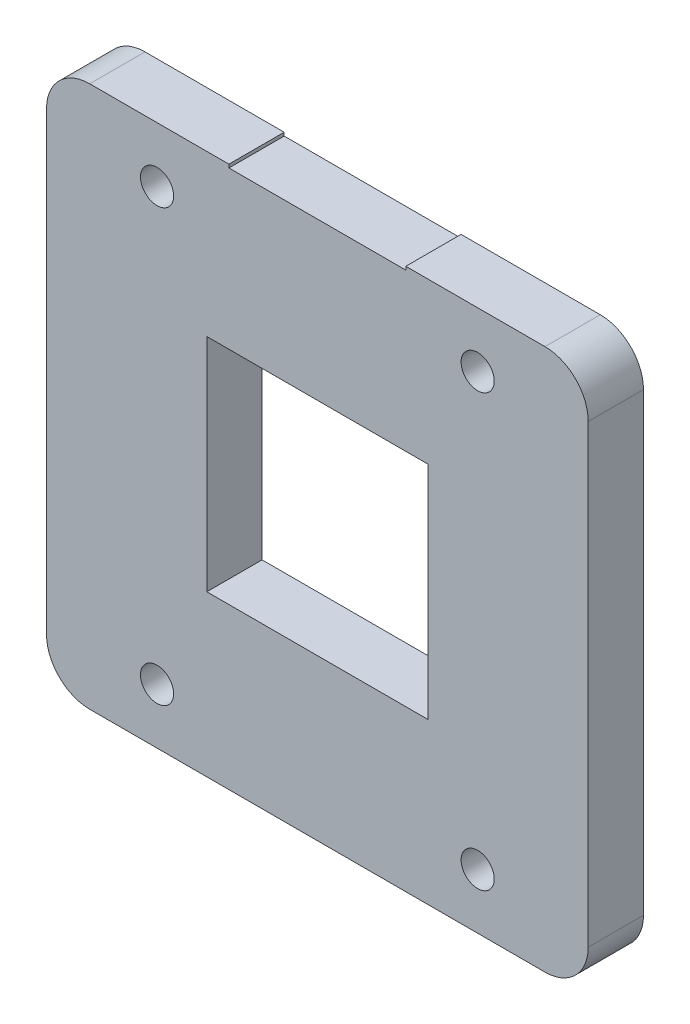
ISO-10303-21;
HEADER;
FILE_DESCRIPTION(('STEP AP214'),'2;1');
FILE_NAME('part.step','',(''),(''),'','','');
FILE_SCHEMA(('AUTOMOTIVE_DESIGN { 1 0 10303 214 1 1 1 1 }'));
ENDSEC;
DATA;
#1=APPLICATION_CONTEXT('core data for automotive mechanical design processes');
#2=APPLICATION_PROTOCOL_DEFINITION('international standard','automotive_design',2000,#1);
#3=PRODUCT_CONTEXT('',#1,'mechanical');
#4=PRODUCT('Part','Part','',(#3));
#5=PRODUCT_RELATED_PRODUCT_CATEGORY('part','',(#4));
#6=PRODUCT_DEFINITION_FORMATION('','',#4);
#7=PRODUCT_DEFINITION_CONTEXT('part definition',#1,'design');
#8=PRODUCT_DEFINITION('design','',#6,#7);
#9=PRODUCT_DEFINITION_SHAPE('','',#8);
#10=(LENGTH_UNIT() NAMED_UNIT(*) SI_UNIT(.MILLI.,.METRE.));
#11=(NAMED_UNIT(*) PLANE_ANGLE_UNIT() SI_UNIT($,.RADIAN.));
#12=(NAMED_UNIT(*) SI_UNIT($,.STERADIAN.) SOLID_ANGLE_UNIT());
#13=UNCERTAINTY_MEASURE_WITH_UNIT(LENGTH_MEASURE(1.E-05),#10,'distance_accuracy_value','');
#14=(GEOMETRIC_REPRESENTATION_CONTEXT(3) GLOBAL_UNCERTAINTY_ASSIGNED_CONTEXT((#13)) GLOBAL_UNIT_ASSIGNED_CONTEXT((#10,
#11,#12)) REPRESENTATION_CONTEXT('',''));
#15=CARTESIAN_POINT('',(0.,0.,0.));
#16=DIRECTION('',(0.,0.,1.));
#17=DIRECTION('',(1.,0.,0.));
#18=AXIS2_PLACEMENT_3D('',#15,#16,#17);
#19=CARTESIAN_POINT('',(0.,24.5,5.));
#20=DIRECTION('',(0.,1.,0.));
#21=DIRECTION('',(0.,0.,1.));
#22=AXIS2_PLACEMENT_3D('',#19,#20,#21);
#23=PLANE('',#22);
#24=DIRECTION('',(0.,0.,-1.));
#25=VECTOR('',#24,1.);
#26=CARTESIAN_POINT('',(8.,24.5,5.));
#27=LINE('',#26,#25);
#28=CARTESIAN_POINT('',(8.,24.5,5.));
#29=VERTEX_POINT('',#28);
#30=CARTESIAN_POINT('',(8.,24.5,0.));
#31=VERTEX_POINT('',#30);
#32=EDGE_CURVE('E183',#29,#31,#27,.T.);
#33=ORIENTED_EDGE('',*,*,#32,.F.);
#34=DIRECTION('',(1.,0.,0.));
#35=VECTOR('',#34,1.);
#36=CARTESIAN_POINT('',(0.,24.5,5.));
#37=LINE('',#36,#35);
#38=CARTESIAN_POINT('',(20.59,24.5,5.));
#39=VERTEX_POINT('',#38);
#40=EDGE_CURVE('E172',#29,#39,#37,.T.);
#41=ORIENTED_EDGE('',*,*,#40,.T.);
#42=DIRECTION('',(0.,0.,-1.));
#43=VECTOR('',#42,1.);
#44=CARTESIAN_POINT('',(20.59,24.5,5.));
#45=LINE('',#44,#43);
#46=CARTESIAN_POINT('',(20.59,24.5,0.));
#47=VERTEX_POINT('',#46);
#48=EDGE_CURVE('E293',#39,#47,#45,.T.);
#49=ORIENTED_EDGE('',*,*,#48,.T.);
#50=DIRECTION('',(1.,0.,0.));
#51=VECTOR('',#50,1.);
#52=CARTESIAN_POINT('',(0.,24.5,0.));
#53=LINE('',#52,#51);
#54=EDGE_CURVE('E269',#31,#47,#53,.T.);
#55=ORIENTED_EDGE('',*,*,#54,.F.);
#56=EDGE_LOOP('',(#33,#41,#49,#55));
#57=FACE_BOUND('',#56,.T.);
#58=ADVANCED_FACE('F41',(#57),#23,.T.);
#59=CARTESIAN_POINT('',(20.59,-20.59,5.));
#60=DIRECTION('',(0.,0.,-1.));
#61=DIRECTION('',(-1.,0.,0.));
#62=AXIS2_PLACEMENT_3D('',#59,#60,#61);
#63=CYLINDRICAL_SURFACE('',#62,3.91);
#64=CARTESIAN_POINT('',(20.59,-20.59,0.));
#65=DIRECTION('',(0.,0.,1.));
#66=DIRECTION('',(1.,0.,0.));
#67=AXIS2_PLACEMENT_3D('',#64,#65,#66);
#68=CIRCLE('',#67,3.91);
#69=CARTESIAN_POINT('',(24.5,-20.59,0.));
#70=VERTEX_POINT('',#69);
#71=CARTESIAN_POINT('',(20.59,-24.5,0.));
#72=VERTEX_POINT('',#71);
#73=EDGE_CURVE('E233',#70,#72,#68,.F.);
#74=ORIENTED_EDGE('',*,*,#73,.F.);
#75=DIRECTION('',(0.,0.,-1.));
#76=VECTOR('',#75,1.);
#77=CARTESIAN_POINT('',(24.5,-20.59,5.));
#78=LINE('',#77,#76);
#79=CARTESIAN_POINT('',(24.5,-20.59,5.));
#80=VERTEX_POINT('',#79);
#81=EDGE_CURVE('E49',#80,#70,#78,.T.);
#82=ORIENTED_EDGE('',*,*,#81,.F.);
#83=CARTESIAN_POINT('',(20.59,-20.59,5.));
#84=DIRECTION('',(0.,0.,1.));
#85=DIRECTION('',(1.,0.,0.));
#86=AXIS2_PLACEMENT_3D('',#83,#84,#85);
#87=CIRCLE('',#86,3.91);
#88=CARTESIAN_POINT('',(20.59,-24.5,5.));
#89=VERTEX_POINT('',#88);
#90=EDGE_CURVE('E239',#80,#89,#87,.F.);
#91=ORIENTED_EDGE('',*,*,#90,.T.);
#92=DIRECTION('',(0.,0.,-1.));
#93=VECTOR('',#92,1.);
#94=CARTESIAN_POINT('',(20.59,-24.5,5.));
#95=LINE('',#94,#93);
#96=EDGE_CURVE('E260',#89,#72,#95,.T.);
#97=ORIENTED_EDGE('',*,*,#96,.T.);
#98=EDGE_LOOP('',(#74,#82,#91,#97));
#99=FACE_BOUND('',#98,.T.);
#100=ADVANCED_FACE('F43',(#99),#63,.T.);
#101=CARTESIAN_POINT('',(24.5,0.,5.));
#102=DIRECTION('',(1.,0.,0.));
#103=DIRECTION('',(0.,1.,0.));
#104=AXIS2_PLACEMENT_3D('',#101,#102,#103);
#105=PLANE('',#104);
#106=DIRECTION('',(0.,-1.,0.));
#107=VECTOR('',#106,1.);
#108=CARTESIAN_POINT('',(24.5,0.,0.));
#109=LINE('',#108,#107);
#110=CARTESIAN_POINT('',(24.5,20.59,0.));
#111=VERTEX_POINT('',#110);
#112=EDGE_CURVE('E263',#111,#70,#109,.T.);
#113=ORIENTED_EDGE('',*,*,#112,.F.);
#114=DIRECTION('',(0.,0.,-1.));
#115=VECTOR('',#114,1.);
#116=CARTESIAN_POINT('',(24.5,20.59,5.));
#117=LINE('',#116,#115);
#118=CARTESIAN_POINT('',(24.5,20.59,5.));
#119=VERTEX_POINT('',#118);
#120=EDGE_CURVE('E296',#119,#111,#117,.T.);
#121=ORIENTED_EDGE('',*,*,#120,.F.);
#122=DIRECTION('',(0.,-1.,0.));
#123=VECTOR('',#122,1.);
#124=CARTESIAN_POINT('',(24.5,0.,5.));
#125=LINE('',#124,#123);
#126=EDGE_CURVE('E242',#119,#80,#125,.T.);
#127=ORIENTED_EDGE('',*,*,#126,.T.);
#128=ORIENTED_EDGE('',*,*,#81,.T.);
#129=EDGE_LOOP('',(#113,#121,#127,#128));
#130=FACE_BOUND('',#129,.T.);
#131=ADVANCED_FACE('F300',(#130),#105,.T.);
#132=CARTESIAN_POINT('',(20.59,20.59,5.));
#133=DIRECTION('',(0.,0.,-1.));
#134=DIRECTION('',(-1.,0.,0.));
#135=AXIS2_PLACEMENT_3D('',#132,#133,#134);
#136=CYLINDRICAL_SURFACE('',#135,3.91);
#137=CARTESIAN_POINT('',(20.59,20.59,0.));
#138=DIRECTION('',(0.,0.,1.));
#139=DIRECTION('',(1.,0.,0.));
#140=AXIS2_PLACEMENT_3D('',#137,#138,#139);
#141=CIRCLE('',#140,3.91);
#142=EDGE_CURVE('E266',#47,#111,#141,.F.);
#143=ORIENTED_EDGE('',*,*,#142,.F.);
#144=ORIENTED_EDGE('',*,*,#48,.F.);
#145=CARTESIAN_POINT('',(20.59,20.59,5.));
#146=DIRECTION('',(0.,0.,1.));
#147=DIRECTION('',(1.,0.,0.));
#148=AXIS2_PLACEMENT_3D('',#145,#146,#147);
#149=CIRCLE('',#148,3.91);
#150=EDGE_CURVE('E246',#39,#119,#149,.F.);
#151=ORIENTED_EDGE('',*,*,#150,.T.);
#152=ORIENTED_EDGE('',*,*,#120,.T.);
#153=EDGE_LOOP('',(#143,#144,#151,#152));
#154=FACE_BOUND('',#153,.T.);
#155=ADVANCED_FACE('F312',(#154),#136,.T.);
#156=DIRECTION('',(0.,0.,1.));
#157=VECTOR('',#156,1.);
#158=CARTESIAN_POINT('',(-8.,24.5,5.));
#159=LINE('',#158,#157);
#160=CARTESIAN_POINT('',(-8.,24.5,0.));
#161=VERTEX_POINT('',#160);
#162=CARTESIAN_POINT('',(-8.,24.5,5.));
#163=VERTEX_POINT('',#162);
#164=EDGE_CURVE('E180',#161,#163,#159,.T.);
#165=ORIENTED_EDGE('',*,*,#164,.F.);
#166=CARTESIAN_POINT('',(-20.59,24.5,0.));
#167=VERTEX_POINT('',#166);
#168=EDGE_CURVE('E270',#167,#161,#53,.T.);
#169=ORIENTED_EDGE('',*,*,#168,.F.);
#170=DIRECTION('',(0.,0.,-1.));
#171=VECTOR('',#170,1.);
#172=CARTESIAN_POINT('',(-20.59,24.5,5.));
#173=LINE('',#172,#171);
#174=CARTESIAN_POINT('',(-20.59,24.5,5.));
#175=VERTEX_POINT('',#174);
#176=EDGE_CURVE('E291',#175,#167,#173,.T.);
#177=ORIENTED_EDGE('',*,*,#176,.F.);
#178=EDGE_CURVE('E249',#175,#163,#37,.T.);
#179=ORIENTED_EDGE('',*,*,#178,.T.);
#180=EDGE_LOOP('',(#165,#169,#177,#179));
#181=FACE_BOUND('',#180,.T.);
#182=ADVANCED_FACE('F336',(#181),#23,.T.);
#183=CARTESIAN_POINT('',(-20.59,20.59,5.));
#184=DIRECTION('',(0.,0.,-1.));
#185=DIRECTION('',(-1.,0.,0.));
#186=AXIS2_PLACEMENT_3D('',#183,#184,#185);
#187=CYLINDRICAL_SURFACE('',#186,3.91);
#188=CARTESIAN_POINT('',(-20.59,20.59,0.));
#189=DIRECTION('',(0.,0.,1.));
#190=DIRECTION('',(1.,0.,0.));
#191=AXIS2_PLACEMENT_3D('',#188,#189,#190);
#192=CIRCLE('',#191,3.91);
#193=CARTESIAN_POINT('',(-24.5,20.59,0.));
#194=VERTEX_POINT('',#193);
#195=EDGE_CURVE('E273',#167,#194,#192,.T.);
#196=ORIENTED_EDGE('',*,*,#195,.T.);
#197=DIRECTION('',(0.,0.,-1.));
#198=VECTOR('',#197,1.);
#199=CARTESIAN_POINT('',(-24.5,20.59,5.));
#200=LINE('',#199,#198);
#201=CARTESIAN_POINT('',(-24.5,20.59,5.));
#202=VERTEX_POINT('',#201);
#203=EDGE_CURVE('E288',#202,#194,#200,.T.);
#204=ORIENTED_EDGE('',*,*,#203,.F.);
#205=CARTESIAN_POINT('',(-20.59,20.59,5.));
#206=DIRECTION('',(0.,0.,1.));
#207=DIRECTION('',(1.,0.,0.));
#208=AXIS2_PLACEMENT_3D('',#205,#206,#207);
#209=CIRCLE('',#208,3.91);
#210=EDGE_CURVE('E252',#175,#202,#209,.T.);
#211=ORIENTED_EDGE('',*,*,#210,.F.);
#212=ORIENTED_EDGE('',*,*,#176,.T.);
#213=EDGE_LOOP('',(#196,#204,#211,#212));
#214=FACE_BOUND('',#213,.T.);
#215=ADVANCED_FACE('F330',(#214),#187,.T.);
#216=CARTESIAN_POINT('',(-24.5,0.,5.));
#217=DIRECTION('',(1.,0.,0.));
#218=DIRECTION('',(0.,1.,0.));
#219=AXIS2_PLACEMENT_3D('',#216,#217,#218);
#220=PLANE('',#219);
#221=DIRECTION('',(0.,-1.,0.));
#222=VECTOR('',#221,1.);
#223=CARTESIAN_POINT('',(-24.5,0.,0.));
#224=LINE('',#223,#222);
#225=CARTESIAN_POINT('',(-24.5,-20.59,0.));
#226=VERTEX_POINT('',#225);
#227=EDGE_CURVE('E275',#194,#226,#224,.T.);
#228=ORIENTED_EDGE('',*,*,#227,.T.);
#229=DIRECTION('',(0.,0.,-1.));
#230=VECTOR('',#229,1.);
#231=CARTESIAN_POINT('',(-24.5,-20.59,5.));
#232=LINE('',#231,#230);
#233=CARTESIAN_POINT('',(-24.5,-20.59,5.));
#234=VERTEX_POINT('',#233);
#235=EDGE_CURVE('E285',#234,#226,#232,.T.);
#236=ORIENTED_EDGE('',*,*,#235,.F.);
#237=DIRECTION('',(0.,-1.,0.));
#238=VECTOR('',#237,1.);
#239=CARTESIAN_POINT('',(-24.5,0.,5.));
#240=LINE('',#239,#238);
#241=EDGE_CURVE('E254',#202,#234,#240,.T.);
#242=ORIENTED_EDGE('',*,*,#241,.F.);
#243=ORIENTED_EDGE('',*,*,#203,.T.);
#244=EDGE_LOOP('',(#228,#236,#242,#243));
#245=FACE_BOUND('',#244,.T.);
#246=ADVANCED_FACE('F326',(#245),#220,.F.);
#247=CARTESIAN_POINT('',(-20.59,-20.59,5.));
#248=DIRECTION('',(0.,0.,-1.));
#249=DIRECTION('',(-1.,0.,0.));
#250=AXIS2_PLACEMENT_3D('',#247,#248,#249);
#251=CYLINDRICAL_SURFACE('',#250,3.91);
#252=CARTESIAN_POINT('',(-20.59,-20.59,0.));
#253=DIRECTION('',(0.,0.,1.));
#254=DIRECTION('',(1.,0.,0.));
#255=AXIS2_PLACEMENT_3D('',#252,#253,#254);
#256=CIRCLE('',#255,3.91);
#257=CARTESIAN_POINT('',(-20.59,-24.5,0.));
#258=VERTEX_POINT('',#257);
#259=EDGE_CURVE('E277',#226,#258,#256,.T.);
#260=ORIENTED_EDGE('',*,*,#259,.T.);
#261=DIRECTION('',(0.,0.,-1.));
#262=VECTOR('',#261,1.);
#263=CARTESIAN_POINT('',(-20.59,-24.5,5.));
#264=LINE('',#263,#262);
#265=CARTESIAN_POINT('',(-20.59,-24.5,5.));
#266=VERTEX_POINT('',#265);
#267=EDGE_CURVE('E282',#266,#258,#264,.T.);
#268=ORIENTED_EDGE('',*,*,#267,.F.);
#269=CARTESIAN_POINT('',(-20.59,-20.59,5.));
#270=DIRECTION('',(0.,0.,1.));
#271=DIRECTION('',(1.,0.,0.));
#272=AXIS2_PLACEMENT_3D('',#269,#270,#271);
#273=CIRCLE('',#272,3.91);
#274=EDGE_CURVE('E256',#234,#266,#273,.T.);
#275=ORIENTED_EDGE('',*,*,#274,.F.);
#276=ORIENTED_EDGE('',*,*,#235,.T.);
#277=EDGE_LOOP('',(#260,#268,#275,#276));
#278=FACE_BOUND('',#277,.T.);
#279=ADVANCED_FACE('F322',(#278),#251,.T.);
#280=CARTESIAN_POINT('',(0.,-24.5,5.));
#281=DIRECTION('',(0.,1.,0.));
#282=DIRECTION('',(0.,0.,1.));
#283=AXIS2_PLACEMENT_3D('',#280,#281,#282);
#284=PLANE('',#283);
#285=DIRECTION('',(1.,0.,0.));
#286=VECTOR('',#285,1.);
#287=CARTESIAN_POINT('',(0.,-24.5,0.));
#288=LINE('',#287,#286);
#289=EDGE_CURVE('E243',#258,#72,#288,.T.);
#290=ORIENTED_EDGE('',*,*,#289,.T.);
#291=ORIENTED_EDGE('',*,*,#96,.F.);
#292=DIRECTION('',(1.,0.,0.));
#293=VECTOR('',#292,1.);
#294=CARTESIAN_POINT('',(0.,-24.5,5.));
#295=LINE('',#294,#293);
#296=EDGE_CURVE('E258',#266,#89,#295,.T.);
#297=ORIENTED_EDGE('',*,*,#296,.F.);
#298=ORIENTED_EDGE('',*,*,#267,.T.);
#299=EDGE_LOOP('',(#290,#291,#297,#298));
#300=FACE_BOUND('',#299,.T.);
#301=ADVANCED_FACE('F317',(#300),#284,.F.);
#302=CARTESIAN_POINT('',(0.,0.,5.));
#303=DIRECTION('',(0.,0.,1.));
#304=DIRECTION('',(1.,0.,0.));
#305=AXIS2_PLACEMENT_3D('',#302,#303,#304);
#306=PLANE('',#305);
#307=DIRECTION('',(0.,-1.,0.));
#308=VECTOR('',#307,1.);
#309=CARTESIAN_POINT('',(8.,25.,5.));
#310=LINE('',#309,#308);
#311=CARTESIAN_POINT('',(8.,24.2,5.));
#312=VERTEX_POINT('',#311);
#313=EDGE_CURVE('E155',#29,#312,#310,.T.);
#314=ORIENTED_EDGE('',*,*,#313,.T.);
#315=DIRECTION('',(-1.,0.,0.));
#316=VECTOR('',#315,1.);
#317=CARTESIAN_POINT('',(8.,24.2,5.));
#318=LINE('',#317,#316);
#319=CARTESIAN_POINT('',(-8.,24.2,5.));
#320=VERTEX_POINT('',#319);
#321=EDGE_CURVE('E162',#312,#320,#318,.T.);
#322=ORIENTED_EDGE('',*,*,#321,.T.);
#323=DIRECTION('',(0.,1.,0.));
#324=VECTOR('',#323,1.);
#325=CARTESIAN_POINT('',(-8.,25.,5.));
#326=LINE('',#325,#324);
#327=EDGE_CURVE('E159',#320,#163,#326,.T.);
#328=ORIENTED_EDGE('',*,*,#327,.T.);
#329=ORIENTED_EDGE('',*,*,#178,.F.);
#330=ORIENTED_EDGE('',*,*,#210,.T.);
#331=ORIENTED_EDGE('',*,*,#241,.T.);
#332=ORIENTED_EDGE('',*,*,#274,.T.);
#333=ORIENTED_EDGE('',*,*,#296,.T.);
#334=ORIENTED_EDGE('',*,*,#90,.F.);
#335=ORIENTED_EDGE('',*,*,#126,.F.);
#336=ORIENTED_EDGE('',*,*,#150,.F.);
#337=ORIENTED_EDGE('',*,*,#40,.F.);
#338=EDGE_LOOP('',(#314,#322,#328,#329,#330,#331,#332,#333,#334,#335,#336,#337));
#339=FACE_BOUND('',#338,.T.);
#340=CARTESIAN_POINT('',(-14.5,-19.5,5.));
#341=DIRECTION('',(0.,0.,1.));
#342=DIRECTION('',(1.,0.,0.));
#343=AXIS2_PLACEMENT_3D('',#340,#341,#342);
#344=CIRCLE('',#343,1.5);
#345=CARTESIAN_POINT('',(-13.,-19.5,5.));
#346=VERTEX_POINT('',#345);
#347=EDGE_CURVE('E199',#346,#346,#344,.T.);
#348=ORIENTED_EDGE('',*,*,#347,.F.);
#349=EDGE_LOOP('',(#348));
#350=FACE_BOUND('',#349,.T.);
#351=CARTESIAN_POINT('',(14.5,-19.5,5.));
#352=DIRECTION('',(0.,0.,1.));
#353=DIRECTION('',(1.,0.,0.));
#354=AXIS2_PLACEMENT_3D('',#351,#352,#353);
#355=CIRCLE('',#354,1.5);
#356=CARTESIAN_POINT('',(16.,-19.5,5.));
#357=VERTEX_POINT('',#356);
#358=EDGE_CURVE('E193',#357,#357,#355,.T.);
#359=ORIENTED_EDGE('',*,*,#358,.F.);
#360=EDGE_LOOP('',(#359));
#361=FACE_BOUND('',#360,.T.);
#362=CARTESIAN_POINT('',(14.5,19.5,5.));
#363=DIRECTION('',(0.,0.,1.));
#364=DIRECTION('',(1.,0.,0.));
#365=AXIS2_PLACEMENT_3D('',#362,#363,#364);
#366=CIRCLE('',#365,1.5);
#367=CARTESIAN_POINT('',(16.,19.5,5.));
#368=VERTEX_POINT('',#367);
#369=EDGE_CURVE('E186',#368,#368,#366,.T.);
#370=ORIENTED_EDGE('',*,*,#369,.F.);
#371=EDGE_LOOP('',(#370));
#372=FACE_BOUND('',#371,.T.);
#373=CARTESIAN_POINT('',(-14.5,19.5,5.));
#374=DIRECTION('',(0.,0.,1.));
#375=DIRECTION('',(1.,0.,0.));
#376=AXIS2_PLACEMENT_3D('',#373,#374,#375);
#377=CIRCLE('',#376,1.5);
#378=CARTESIAN_POINT('',(-13.,19.5,5.));
#379=VERTEX_POINT('',#378);
#380=EDGE_CURVE('E189',#379,#379,#377,.T.);
#381=ORIENTED_EDGE('',*,*,#380,.F.);
#382=EDGE_LOOP('',(#381));
#383=FACE_BOUND('',#382,.T.);
#384=DIRECTION('',(1.,0.,0.));
#385=VECTOR('',#384,1.);
#386=CARTESIAN_POINT('',(0.,-10.,5.));
#387=LINE('',#386,#385);
#388=CARTESIAN_POINT('',(-10.,-10.,5.));
#389=VERTEX_POINT('',#388);
#390=CARTESIAN_POINT('',(10.,-10.,5.));
#391=VERTEX_POINT('',#390);
#392=EDGE_CURVE('E64',#389,#391,#387,.T.);
#393=ORIENTED_EDGE('',*,*,#392,.F.);
#394=DIRECTION('',(0.,1.,0.));
#395=VECTOR('',#394,1.);
#396=CARTESIAN_POINT('',(-10.,0.,5.));
#397=LINE('',#396,#395);
#398=CARTESIAN_POINT('',(-10.,10.,5.));
#399=VERTEX_POINT('',#398);
#400=EDGE_CURVE('E213',#389,#399,#397,.T.);
#401=ORIENTED_EDGE('',*,*,#400,.T.);
#402=DIRECTION('',(1.,0.,0.));
#403=VECTOR('',#402,1.);
#404=CARTESIAN_POINT('',(0.,10.,5.));
#405=LINE('',#404,#403);
#406=CARTESIAN_POINT('',(10.,10.,5.));
#407=VERTEX_POINT('',#406);
#408=EDGE_CURVE('E226',#399,#407,#405,.T.);
#409=ORIENTED_EDGE('',*,*,#408,.T.);
#410=DIRECTION('',(0.,1.,0.));
#411=VECTOR('',#410,1.);
#412=CARTESIAN_POINT('',(10.,0.,5.));
#413=LINE('',#412,#411);
#414=EDGE_CURVE('E223',#391,#407,#413,.T.);
#415=ORIENTED_EDGE('',*,*,#414,.F.);
#416=EDGE_LOOP('',(#393,#401,#409,#415));
#417=FACE_BOUND('',#416,.T.);
#418=ADVANCED_FACE('F169',(#339,#350,#361,#372,#383,#417),#306,.T.);
#419=CARTESIAN_POINT('',(0.,0.,0.));
#420=DIRECTION('',(0.,0.,1.));
#421=DIRECTION('',(1.,0.,0.));
#422=AXIS2_PLACEMENT_3D('',#419,#420,#421);
#423=PLANE('',#422);
#424=CARTESIAN_POINT('',(-14.5,-19.5,0.));
#425=DIRECTION('',(0.,0.,1.));
#426=DIRECTION('',(1.,0.,0.));
#427=AXIS2_PLACEMENT_3D('',#424,#425,#426);
#428=CIRCLE('',#427,1.5);
#429=CARTESIAN_POINT('',(-13.,-19.5,0.));
#430=VERTEX_POINT('',#429);
#431=EDGE_CURVE('E185',#430,#430,#428,.T.);
#432=ORIENTED_EDGE('',*,*,#431,.T.);
#433=EDGE_LOOP('',(#432));
#434=FACE_BOUND('',#433,.T.);
#435=CARTESIAN_POINT('',(14.5,-19.5,0.));
#436=DIRECTION('',(0.,0.,1.));
#437=DIRECTION('',(1.,0.,0.));
#438=AXIS2_PLACEMENT_3D('',#435,#436,#437);
#439=CIRCLE('',#438,1.5);
#440=CARTESIAN_POINT('',(16.,-19.5,0.));
#441=VERTEX_POINT('',#440);
#442=EDGE_CURVE('E196',#441,#441,#439,.T.);
#443=ORIENTED_EDGE('',*,*,#442,.T.);
#444=EDGE_LOOP('',(#443));
#445=FACE_BOUND('',#444,.T.);
#446=CARTESIAN_POINT('',(14.5,19.5,0.));
#447=DIRECTION('',(0.,0.,1.));
#448=DIRECTION('',(1.,0.,0.));
#449=AXIS2_PLACEMENT_3D('',#446,#447,#448);
#450=CIRCLE('',#449,1.5);
#451=CARTESIAN_POINT('',(16.,19.5,0.));
#452=VERTEX_POINT('',#451);
#453=EDGE_CURVE('E190',#452,#452,#450,.T.);
#454=ORIENTED_EDGE('',*,*,#453,.T.);
#455=EDGE_LOOP('',(#454));
#456=FACE_BOUND('',#455,.T.);
#457=CARTESIAN_POINT('',(-14.5,19.5,0.));
#458=DIRECTION('',(0.,0.,1.));
#459=DIRECTION('',(1.,0.,0.));
#460=AXIS2_PLACEMENT_3D('',#457,#458,#459);
#461=CIRCLE('',#460,1.5);
#462=CARTESIAN_POINT('',(-13.,19.5,0.));
#463=VERTEX_POINT('',#462);
#464=EDGE_CURVE('E204',#463,#463,#461,.T.);
#465=ORIENTED_EDGE('',*,*,#464,.T.);
#466=EDGE_LOOP('',(#465));
#467=FACE_BOUND('',#466,.T.);
#468=DIRECTION('',(0.,1.,0.));
#469=VECTOR('',#468,1.);
#470=CARTESIAN_POINT('',(-10.,0.,0.));
#471=LINE('',#470,#469);
#472=CARTESIAN_POINT('',(-10.,-10.,0.));
#473=VERTEX_POINT('',#472);
#474=CARTESIAN_POINT('',(-10.,10.,0.));
#475=VERTEX_POINT('',#474);
#476=EDGE_CURVE('E219',#473,#475,#471,.T.);
#477=ORIENTED_EDGE('',*,*,#476,.F.);
#478=DIRECTION('',(1.,0.,0.));
#479=VECTOR('',#478,1.);
#480=CARTESIAN_POINT('',(0.,-10.,0.));
#481=LINE('',#480,#479);
#482=CARTESIAN_POINT('',(10.,-10.,0.));
#483=VERTEX_POINT('',#482);
#484=EDGE_CURVE('E209',#473,#483,#481,.T.);
#485=ORIENTED_EDGE('',*,*,#484,.T.);
#486=DIRECTION('',(0.,1.,0.));
#487=VECTOR('',#486,1.);
#488=CARTESIAN_POINT('',(10.,0.,0.));
#489=LINE('',#488,#487);
#490=CARTESIAN_POINT('',(10.,10.,0.));
#491=VERTEX_POINT('',#490);
#492=EDGE_CURVE('E212',#483,#491,#489,.T.);
#493=ORIENTED_EDGE('',*,*,#492,.T.);
#494=DIRECTION('',(1.,0.,0.));
#495=VECTOR('',#494,1.);
#496=CARTESIAN_POINT('',(0.,10.,0.));
#497=LINE('',#496,#495);
#498=EDGE_CURVE('E216',#475,#491,#497,.T.);
#499=ORIENTED_EDGE('',*,*,#498,.F.);
#500=EDGE_LOOP('',(#477,#485,#493,#499));
#501=FACE_BOUND('',#500,.T.);
#502=DIRECTION('',(-1.,0.,0.));
#503=VECTOR('',#502,1.);
#504=CARTESIAN_POINT('',(8.,24.2,0.));
#505=LINE('',#504,#503);
#506=CARTESIAN_POINT('',(8.,24.2,0.));
#507=VERTEX_POINT('',#506);
#508=CARTESIAN_POINT('',(-8.,24.2,0.));
#509=VERTEX_POINT('',#508);
#510=EDGE_CURVE('E175',#507,#509,#505,.T.);
#511=ORIENTED_EDGE('',*,*,#510,.F.);
#512=DIRECTION('',(0.,1.,0.));
#513=VECTOR('',#512,1.);
#514=CARTESIAN_POINT('',(8.,0.,0.));
#515=LINE('',#514,#513);
#516=EDGE_CURVE('E11',#507,#31,#515,.T.);
#517=ORIENTED_EDGE('',*,*,#516,.T.);
#518=ORIENTED_EDGE('',*,*,#54,.T.);
#519=ORIENTED_EDGE('',*,*,#142,.T.);
#520=ORIENTED_EDGE('',*,*,#112,.T.);
#521=ORIENTED_EDGE('',*,*,#73,.T.);
#522=ORIENTED_EDGE('',*,*,#289,.F.);
#523=ORIENTED_EDGE('',*,*,#259,.F.);
#524=ORIENTED_EDGE('',*,*,#227,.F.);
#525=ORIENTED_EDGE('',*,*,#195,.F.);
#526=ORIENTED_EDGE('',*,*,#168,.T.);
#527=DIRECTION('',(0.,1.,0.));
#528=VECTOR('',#527,1.);
#529=CARTESIAN_POINT('',(-8.,25.,0.));
#530=LINE('',#529,#528);
#531=EDGE_CURVE('E173',#509,#161,#530,.T.);
#532=ORIENTED_EDGE('',*,*,#531,.F.);
#533=EDGE_LOOP('',(#511,#517,#518,#519,#520,#521,#522,#523,#524,#525,#526,#532));
#534=FACE_BOUND('',#533,.T.);
#535=ADVANCED_FACE('F307',(#434,#445,#456,#467,#501,#534),#423,.F.);
#536=CARTESIAN_POINT('',(0.,-10.,0.));
#537=DIRECTION('',(0.,-1.,0.));
#538=DIRECTION('',(0.,0.,-1.));
#539=AXIS2_PLACEMENT_3D('',#536,#537,#538);
#540=PLANE('',#539);
#541=ORIENTED_EDGE('',*,*,#392,.T.);
#542=DIRECTION('',(0.,0.,1.));
#543=VECTOR('',#542,1.);
#544=CARTESIAN_POINT('',(10.,-10.,0.));
#545=LINE('',#544,#543);
#546=EDGE_CURVE('E221',#483,#391,#545,.T.);
#547=ORIENTED_EDGE('',*,*,#546,.F.);
#548=ORIENTED_EDGE('',*,*,#484,.F.);
#549=DIRECTION('',(0.,0.,1.));
#550=VECTOR('',#549,1.);
#551=CARTESIAN_POINT('',(-10.,-10.,0.));
#552=LINE('',#551,#550);
#553=EDGE_CURVE('E231',#473,#389,#552,.T.);
#554=ORIENTED_EDGE('',*,*,#553,.T.);
#555=EDGE_LOOP('',(#541,#547,#548,#554));
#556=FACE_BOUND('',#555,.T.);
#557=ADVANCED_FACE('F414',(#556),#540,.F.);
#558=CARTESIAN_POINT('',(-10.,0.,0.));
#559=DIRECTION('',(1.,0.,0.));
#560=DIRECTION('',(0.,0.,-1.));
#561=AXIS2_PLACEMENT_3D('',#558,#559,#560);
#562=PLANE('',#561);
#563=ORIENTED_EDGE('',*,*,#400,.F.);
#564=ORIENTED_EDGE('',*,*,#553,.F.);
#565=ORIENTED_EDGE('',*,*,#476,.T.);
#566=DIRECTION('',(0.,0.,1.));
#567=VECTOR('',#566,1.);
#568=CARTESIAN_POINT('',(-10.,10.,0.));
#569=LINE('',#568,#567);
#570=EDGE_CURVE('E234',#475,#399,#569,.T.);
#571=ORIENTED_EDGE('',*,*,#570,.T.);
#572=EDGE_LOOP('',(#563,#564,#565,#571));
#573=FACE_BOUND('',#572,.T.);
#574=ADVANCED_FACE('F423',(#573),#562,.T.);
#575=CARTESIAN_POINT('',(0.,10.,0.));
#576=DIRECTION('',(0.,-1.,0.));
#577=DIRECTION('',(0.,0.,-1.));
#578=AXIS2_PLACEMENT_3D('',#575,#576,#577);
#579=PLANE('',#578);
#580=ORIENTED_EDGE('',*,*,#408,.F.);
#581=ORIENTED_EDGE('',*,*,#570,.F.);
#582=ORIENTED_EDGE('',*,*,#498,.T.);
#583=DIRECTION('',(0.,0.,1.));
#584=VECTOR('',#583,1.);
#585=CARTESIAN_POINT('',(10.,10.,0.));
#586=LINE('',#585,#584);
#587=EDGE_CURVE('E236',#491,#407,#586,.T.);
#588=ORIENTED_EDGE('',*,*,#587,.T.);
#589=EDGE_LOOP('',(#580,#581,#582,#588));
#590=FACE_BOUND('',#589,.T.);
#591=ADVANCED_FACE('F431',(#590),#579,.T.);
#592=CARTESIAN_POINT('',(10.,0.,0.));
#593=DIRECTION('',(1.,0.,0.));
#594=DIRECTION('',(0.,0.,-1.));
#595=AXIS2_PLACEMENT_3D('',#592,#593,#594);
#596=PLANE('',#595);
#597=ORIENTED_EDGE('',*,*,#414,.T.);
#598=ORIENTED_EDGE('',*,*,#587,.F.);
#599=ORIENTED_EDGE('',*,*,#492,.F.);
#600=ORIENTED_EDGE('',*,*,#546,.T.);
#601=EDGE_LOOP('',(#597,#598,#599,#600));
#602=FACE_BOUND('',#601,.T.);
#603=ADVANCED_FACE('F440',(#602),#596,.F.);
#604=CARTESIAN_POINT('',(-14.5,19.5,0.));
#605=DIRECTION('',(0.,0.,1.));
#606=DIRECTION('',(1.,0.,0.));
#607=AXIS2_PLACEMENT_3D('',#604,#605,#606);
#608=CYLINDRICAL_SURFACE('',#607,1.5);
#609=ORIENTED_EDGE('',*,*,#464,.F.);
#610=EDGE_LOOP('',(#609));
#611=FACE_BOUND('',#610,.T.);
#612=ORIENTED_EDGE('',*,*,#380,.T.);
#613=EDGE_LOOP('',(#612));
#614=FACE_BOUND('',#613,.T.);
#615=ADVANCED_FACE('F449',(#611,#614),#608,.F.);
#616=CARTESIAN_POINT('',(14.5,19.5,0.));
#617=DIRECTION('',(0.,0.,1.));
#618=DIRECTION('',(1.,0.,0.));
#619=AXIS2_PLACEMENT_3D('',#616,#617,#618);
#620=CYLINDRICAL_SURFACE('',#619,1.5);
#621=ORIENTED_EDGE('',*,*,#453,.F.);
#622=EDGE_LOOP('',(#621));
#623=FACE_BOUND('',#622,.T.);
#624=ORIENTED_EDGE('',*,*,#369,.T.);
#625=EDGE_LOOP('',(#624));
#626=FACE_BOUND('',#625,.T.);
#627=ADVANCED_FACE('F458',(#623,#626),#620,.F.);
#628=CARTESIAN_POINT('',(14.5,-19.5,0.));
#629=DIRECTION('',(0.,0.,1.));
#630=DIRECTION('',(1.,0.,0.));
#631=AXIS2_PLACEMENT_3D('',#628,#629,#630);
#632=CYLINDRICAL_SURFACE('',#631,1.5);
#633=ORIENTED_EDGE('',*,*,#442,.F.);
#634=EDGE_LOOP('',(#633));
#635=FACE_BOUND('',#634,.T.);
#636=ORIENTED_EDGE('',*,*,#358,.T.);
#637=EDGE_LOOP('',(#636));
#638=FACE_BOUND('',#637,.T.);
#639=ADVANCED_FACE('F467',(#635,#638),#632,.F.);
#640=CARTESIAN_POINT('',(-14.5,-19.5,0.));
#641=DIRECTION('',(0.,0.,1.));
#642=DIRECTION('',(1.,0.,0.));
#643=AXIS2_PLACEMENT_3D('',#640,#641,#642);
#644=CYLINDRICAL_SURFACE('',#643,1.5);
#645=ORIENTED_EDGE('',*,*,#431,.F.);
#646=EDGE_LOOP('',(#645));
#647=FACE_BOUND('',#646,.T.);
#648=ORIENTED_EDGE('',*,*,#347,.T.);
#649=EDGE_LOOP('',(#648));
#650=FACE_BOUND('',#649,.T.);
#651=ADVANCED_FACE('F476',(#647,#650),#644,.F.);
#652=CARTESIAN_POINT('',(8.,25.,5.));
#653=DIRECTION('',(1.,0.,0.));
#654=DIRECTION('',(0.,0.,-1.));
#655=AXIS2_PLACEMENT_3D('',#652,#653,#654);
#656=PLANE('',#655);
#657=ORIENTED_EDGE('',*,*,#32,.T.);
#658=ORIENTED_EDGE('',*,*,#516,.F.);
#659=DIRECTION('',(0.,0.,-1.));
#660=VECTOR('',#659,1.);
#661=CARTESIAN_POINT('',(8.,24.2,5.));
#662=LINE('',#661,#660);
#663=EDGE_CURVE('E56',#312,#507,#662,.T.);
#664=ORIENTED_EDGE('',*,*,#663,.F.);
#665=ORIENTED_EDGE('',*,*,#313,.F.);
#666=EDGE_LOOP('',(#657,#658,#664,#665));
#667=FACE_BOUND('',#666,.T.);
#668=ADVANCED_FACE('F153',(#667),#656,.F.);
#669=CARTESIAN_POINT('',(-8.,25.,5.));
#670=DIRECTION('',(-1.,0.,0.));
#671=DIRECTION('',(0.,0.,1.));
#672=AXIS2_PLACEMENT_3D('',#669,#670,#671);
#673=PLANE('',#672);
#674=ORIENTED_EDGE('',*,*,#164,.T.);
#675=ORIENTED_EDGE('',*,*,#327,.F.);
#676=DIRECTION('',(0.,0.,-1.));
#677=VECTOR('',#676,1.);
#678=CARTESIAN_POINT('',(-8.,24.2,5.));
#679=LINE('',#678,#677);
#680=EDGE_CURVE('E158',#320,#509,#679,.T.);
#681=ORIENTED_EDGE('',*,*,#680,.T.);
#682=ORIENTED_EDGE('',*,*,#531,.T.);
#683=EDGE_LOOP('',(#674,#675,#681,#682));
#684=FACE_BOUND('',#683,.T.);
#685=ADVANCED_FACE('F338',(#684),#673,.F.);
#686=CARTESIAN_POINT('',(8.,24.2,5.));
#687=DIRECTION('',(0.,-1.,0.));
#688=DIRECTION('',(0.,0.,-1.));
#689=AXIS2_PLACEMENT_3D('',#686,#687,#688);
#690=PLANE('',#689);
#691=ORIENTED_EDGE('',*,*,#510,.T.);
#692=ORIENTED_EDGE('',*,*,#680,.F.);
#693=ORIENTED_EDGE('',*,*,#321,.F.);
#694=ORIENTED_EDGE('',*,*,#663,.T.);
#695=EDGE_LOOP('',(#691,#692,#693,#694));
#696=FACE_BOUND('',#695,.T.);
#697=ADVANCED_FACE('F163',(#696),#690,.F.);
#698=CLOSED_SHELL('',(#58,#100,#131,#155,#182,#215,#246,#279,#301,#418,#535,#557,#574,#591,#603,
#615,#627,#639,#651,#668,#685,#697));
#699=MANIFOLD_SOLID_BREP('B2',#698);
#700=ADVANCED_BREP_SHAPE_REPRESENTATION('',(#18,#699),#14);
#701=SHAPE_DEFINITION_REPRESENTATION(#9,#700);
ENDSEC;
END-ISO-10303-21;
